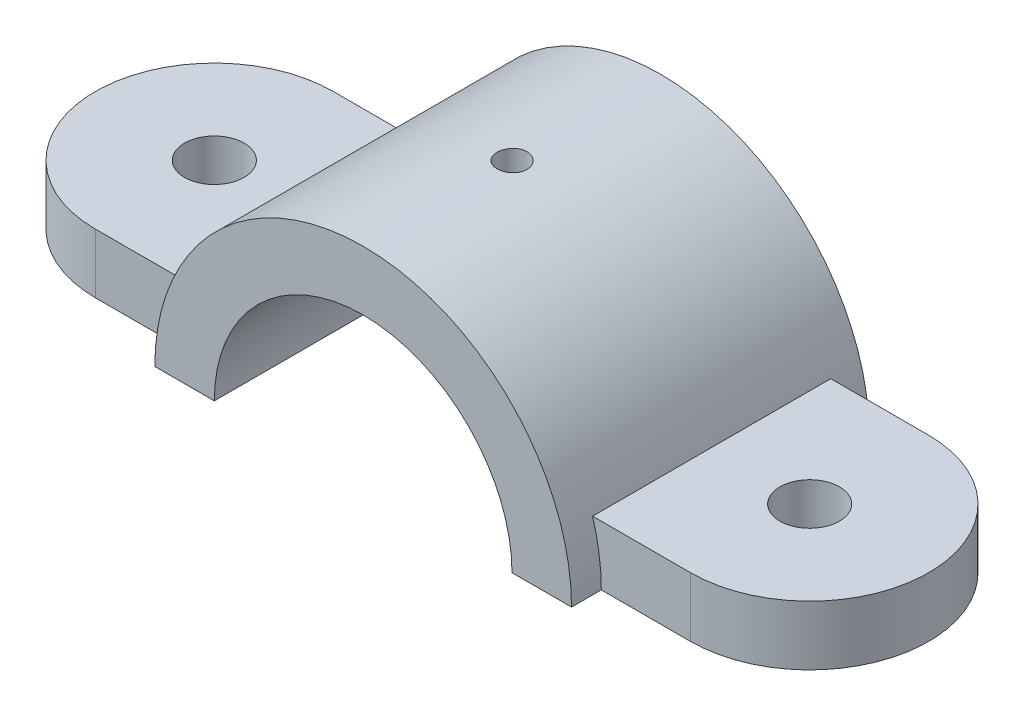
ISO-10303-21;
HEADER;
FILE_DESCRIPTION(('STEP AP214'),'2;1');
FILE_NAME('part.step','',(''),(''),'','','');
FILE_SCHEMA(('AUTOMOTIVE_DESIGN { 1 0 10303 214 1 1 1 1 }'));
ENDSEC;
DATA;
#1=APPLICATION_CONTEXT('core data for automotive mechanical design processes');
#2=APPLICATION_PROTOCOL_DEFINITION('international standard','automotive_design',2000,#1);
#3=PRODUCT_CONTEXT('',#1,'mechanical');
#4=PRODUCT('Part','Part','',(#3));
#5=PRODUCT_RELATED_PRODUCT_CATEGORY('part','',(#4));
#6=PRODUCT_DEFINITION_FORMATION('','',#4);
#7=PRODUCT_DEFINITION_CONTEXT('part definition',#1,'design');
#8=PRODUCT_DEFINITION('design','',#6,#7);
#9=PRODUCT_DEFINITION_SHAPE('','',#8);
#10=(LENGTH_UNIT() NAMED_UNIT(*) SI_UNIT(.MILLI.,.METRE.));
#11=(NAMED_UNIT(*) PLANE_ANGLE_UNIT() SI_UNIT($,.RADIAN.));
#12=(NAMED_UNIT(*) SI_UNIT($,.STERADIAN.) SOLID_ANGLE_UNIT());
#13=UNCERTAINTY_MEASURE_WITH_UNIT(LENGTH_MEASURE(1.E-05),#10,'distance_accuracy_value','');
#14=(GEOMETRIC_REPRESENTATION_CONTEXT(3) GLOBAL_UNCERTAINTY_ASSIGNED_CONTEXT((#13)) GLOBAL_UNIT_ASSIGNED_CONTEXT((#10,
#11,#12)) REPRESENTATION_CONTEXT('',''));
#15=CARTESIAN_POINT('',(0.,0.,0.));
#16=DIRECTION('',(0.,0.,1.));
#17=DIRECTION('',(1.,0.,0.));
#18=AXIS2_PLACEMENT_3D('',#15,#16,#17);
#19=CARTESIAN_POINT('',(63.5,0.,0.));
#20=DIRECTION('',(0.,-1.,0.));
#21=DIRECTION('',(0.,0.,-1.));
#22=AXIS2_PLACEMENT_3D('',#19,#20,#21);
#23=PLANE('',#22);
#24=DIRECTION('',(0.,0.,1.));
#25=VECTOR('',#24,1.);
#26=CARTESIAN_POINT('',(31.75,0.,-31.75));
#27=LINE('',#26,#25);
#28=CARTESIAN_POINT('',(31.75,0.,-31.75));
#29=VERTEX_POINT('',#28);
#30=CARTESIAN_POINT('',(31.75,0.,31.75));
#31=VERTEX_POINT('',#30);
#32=EDGE_CURVE('E139',#29,#31,#27,.T.);
#33=ORIENTED_EDGE('',*,*,#32,.F.);
#34=DIRECTION('',(-1.,0.,0.));
#35=VECTOR('',#34,1.);
#36=CARTESIAN_POINT('',(0.,0.,-31.75));
#37=LINE('',#36,#35);
#38=CARTESIAN_POINT('',(44.45,0.,-31.75));
#39=VERTEX_POINT('',#38);
#40=EDGE_CURVE('E152',#39,#29,#37,.T.);
#41=ORIENTED_EDGE('',*,*,#40,.F.);
#42=DIRECTION('',(0.,0.,-1.));
#43=VECTOR('',#42,1.);
#44=CARTESIAN_POINT('',(44.45,0.,31.75));
#45=LINE('',#44,#43);
#46=CARTESIAN_POINT('',(44.45,0.,-25.4));
#47=VERTEX_POINT('',#46);
#48=EDGE_CURVE('E176',#47,#39,#45,.T.);
#49=ORIENTED_EDGE('',*,*,#48,.F.);
#50=DIRECTION('',(-1.,0.,0.));
#51=VECTOR('',#50,1.);
#52=CARTESIAN_POINT('',(-63.5,0.,-25.4));
#53=LINE('',#52,#51);
#54=CARTESIAN_POINT('',(63.5,0.,-25.4));
#55=VERTEX_POINT('',#54);
#56=EDGE_CURVE('E232',#55,#47,#53,.T.);
#57=ORIENTED_EDGE('',*,*,#56,.F.);
#58=CARTESIAN_POINT('',(63.5,0.,0.));
#59=DIRECTION('',(0.,1.,0.));
#60=DIRECTION('',(0.,0.,-1.));
#61=AXIS2_PLACEMENT_3D('',#58,#59,#60);
#62=CIRCLE('',#61,25.4);
#63=CARTESIAN_POINT('',(63.5,0.,25.4));
#64=VERTEX_POINT('',#63);
#65=EDGE_CURVE('E206',#64,#55,#62,.T.);
#66=ORIENTED_EDGE('',*,*,#65,.F.);
#67=DIRECTION('',(1.,0.,0.));
#68=VECTOR('',#67,1.);
#69=CARTESIAN_POINT('',(63.5,0.,25.4));
#70=LINE('',#69,#68);
#71=CARTESIAN_POINT('',(44.45,0.,25.4));
#72=VERTEX_POINT('',#71);
#73=EDGE_CURVE('E238',#72,#64,#70,.T.);
#74=ORIENTED_EDGE('',*,*,#73,.F.);
#75=CARTESIAN_POINT('',(44.45,0.,31.75));
#76=VERTEX_POINT('',#75);
#77=EDGE_CURVE('E178',#76,#72,#45,.T.);
#78=ORIENTED_EDGE('',*,*,#77,.F.);
#79=DIRECTION('',(-1.,0.,0.));
#80=VECTOR('',#79,1.);
#81=CARTESIAN_POINT('',(0.,0.,31.75));
#82=LINE('',#81,#80);
#83=EDGE_CURVE('E154',#76,#31,#82,.T.);
#84=ORIENTED_EDGE('',*,*,#83,.T.);
#85=EDGE_LOOP('',(#33,#41,#49,#57,#66,#74,#78,#84));
#86=FACE_BOUND('',#85,.T.);
#87=CARTESIAN_POINT('',(63.5,0.,0.));
#88=DIRECTION('',(0.,1.,0.));
#89=DIRECTION('',(0.,0.,-1.));
#90=AXIS2_PLACEMENT_3D('',#87,#88,#89);
#91=CIRCLE('',#90,6.35000000000001);
#92=CARTESIAN_POINT('',(63.5,0.,-6.35000000000001));
#93=VERTEX_POINT('',#92);
#94=EDGE_CURVE('E198',#93,#93,#91,.T.);
#95=ORIENTED_EDGE('',*,*,#94,.T.);
#96=EDGE_LOOP('',(#95));
#97=FACE_BOUND('',#96,.T.);
#98=ADVANCED_FACE('F41',(#86,#97),#23,.T.);
#99=CARTESIAN_POINT('',(63.5,12.7,0.));
#100=DIRECTION('',(0.,-1.,0.));
#101=DIRECTION('',(0.,0.,-1.));
#102=AXIS2_PLACEMENT_3D('',#99,#100,#101);
#103=PLANE('',#102);
#104=CARTESIAN_POINT('',(-63.5,12.7,0.));
#105=DIRECTION('',(0.,1.,0.));
#106=DIRECTION('',(0.,0.,1.));
#107=AXIS2_PLACEMENT_3D('',#104,#105,#106);
#108=CIRCLE('',#107,6.35);
#109=CARTESIAN_POINT('',(-63.5,12.7,6.35));
#110=VERTEX_POINT('',#109);
#111=EDGE_CURVE('E202',#110,#110,#108,.T.);
#112=ORIENTED_EDGE('',*,*,#111,.F.);
#113=EDGE_LOOP('',(#112));
#114=FACE_BOUND('',#113,.T.);
#115=DIRECTION('',(0.,0.,-1.));
#116=VECTOR('',#115,1.);
#117=CARTESIAN_POINT('',(-42.597094971371,12.7,31.75));
#118=LINE('',#117,#116);
#119=CARTESIAN_POINT('',(-42.597094971371,12.7,-25.4));
#120=VERTEX_POINT('',#119);
#121=CARTESIAN_POINT('',(-42.597094971371,12.7,25.4));
#122=VERTEX_POINT('',#121);
#123=EDGE_CURVE('E71',#120,#122,#118,.F.);
#124=ORIENTED_EDGE('',*,*,#123,.F.);
#125=DIRECTION('',(-1.,0.,0.));
#126=VECTOR('',#125,1.);
#127=CARTESIAN_POINT('',(-63.5,12.7,-25.4));
#128=LINE('',#127,#126);
#129=CARTESIAN_POINT('',(-63.5,12.7,-25.4));
#130=VERTEX_POINT('',#129);
#131=EDGE_CURVE('E214',#120,#130,#128,.T.);
#132=ORIENTED_EDGE('',*,*,#131,.T.);
#133=CARTESIAN_POINT('',(-63.5,12.7,0.));
#134=DIRECTION('',(0.,1.,0.));
#135=DIRECTION('',(0.,0.,1.));
#136=AXIS2_PLACEMENT_3D('',#133,#134,#135);
#137=CIRCLE('',#136,25.4);
#138=CARTESIAN_POINT('',(-63.5,12.7,25.4));
#139=VERTEX_POINT('',#138);
#140=EDGE_CURVE('E220',#130,#139,#137,.T.);
#141=ORIENTED_EDGE('',*,*,#140,.T.);
#142=DIRECTION('',(1.,0.,0.));
#143=VECTOR('',#142,1.);
#144=CARTESIAN_POINT('',(63.5,12.7,25.4));
#145=LINE('',#144,#143);
#146=EDGE_CURVE('E224',#139,#122,#145,.T.);
#147=ORIENTED_EDGE('',*,*,#146,.T.);
#148=EDGE_LOOP('',(#124,#132,#141,#147));
#149=FACE_BOUND('',#148,.T.);
#150=ADVANCED_FACE('F281',(#114,#149),#103,.F.);
#151=CARTESIAN_POINT('',(63.5,12.7,0.));
#152=DIRECTION('',(0.,1.,0.));
#153=DIRECTION('',(0.,0.,-1.));
#154=AXIS2_PLACEMENT_3D('',#151,#152,#153);
#155=CIRCLE('',#154,6.35000000000001);
#156=CARTESIAN_POINT('',(63.5,12.7,-6.35000000000001));
#157=VERTEX_POINT('',#156);
#158=EDGE_CURVE('E193',#157,#157,#155,.T.);
#159=ORIENTED_EDGE('',*,*,#158,.F.);
#160=EDGE_LOOP('',(#159));
#161=FACE_BOUND('',#160,.T.);
#162=DIRECTION('',(0.,0.,-1.));
#163=VECTOR('',#162,1.);
#164=CARTESIAN_POINT('',(42.597094971371,12.7,31.75));
#165=LINE('',#164,#163);
#166=CARTESIAN_POINT('',(42.597094971371,12.7,25.4));
#167=VERTEX_POINT('',#166);
#168=CARTESIAN_POINT('',(42.597094971371,12.7,-25.4));
#169=VERTEX_POINT('',#168);
#170=EDGE_CURVE('E188',#167,#169,#165,.T.);
#171=ORIENTED_EDGE('',*,*,#170,.F.);
#172=CARTESIAN_POINT('',(63.5,12.7,25.4));
#173=VERTEX_POINT('',#172);
#174=EDGE_CURVE('E223',#167,#173,#145,.T.);
#175=ORIENTED_EDGE('',*,*,#174,.T.);
#176=CARTESIAN_POINT('',(63.5,12.7,0.));
#177=DIRECTION('',(0.,1.,0.));
#178=DIRECTION('',(0.,0.,-1.));
#179=AXIS2_PLACEMENT_3D('',#176,#177,#178);
#180=CIRCLE('',#179,25.4);
#181=CARTESIAN_POINT('',(63.5,12.7,-25.4));
#182=VERTEX_POINT('',#181);
#183=EDGE_CURVE('E210',#173,#182,#180,.T.);
#184=ORIENTED_EDGE('',*,*,#183,.T.);
#185=EDGE_CURVE('E216',#182,#169,#128,.T.);
#186=ORIENTED_EDGE('',*,*,#185,.T.);
#187=EDGE_LOOP('',(#171,#175,#184,#186));
#188=FACE_BOUND('',#187,.T.);
#189=ADVANCED_FACE('F287',(#161,#188),#103,.F.);
#190=CARTESIAN_POINT('',(-63.5,12.7,-25.4));
#191=DIRECTION('',(0.,0.,1.));
#192=DIRECTION('',(1.,0.,0.));
#193=AXIS2_PLACEMENT_3D('',#190,#191,#192);
#194=PLANE('',#193);
#195=CARTESIAN_POINT('',(0.,0.,-25.4));
#196=DIRECTION('',(0.,0.,1.));
#197=DIRECTION('',(1.,0.,0.));
#198=AXIS2_PLACEMENT_3D('',#195,#196,#197);
#199=CIRCLE('',#198,44.45);
#200=CARTESIAN_POINT('',(-44.45,0.,-25.4));
#201=VERTEX_POINT('',#200);
#202=EDGE_CURVE('E184',#201,#120,#199,.F.);
#203=ORIENTED_EDGE('',*,*,#202,.F.);
#204=CARTESIAN_POINT('',(-63.5,0.,-25.4));
#205=VERTEX_POINT('',#204);
#206=EDGE_CURVE('E231',#201,#205,#53,.T.);
#207=ORIENTED_EDGE('',*,*,#206,.T.);
#208=DIRECTION('',(0.,-1.,0.));
#209=VECTOR('',#208,1.);
#210=CARTESIAN_POINT('',(-63.5,12.7,-25.4));
#211=LINE('',#210,#209);
#212=EDGE_CURVE('E248',#130,#205,#211,.T.);
#213=ORIENTED_EDGE('',*,*,#212,.F.);
#214=ORIENTED_EDGE('',*,*,#131,.F.);
#215=EDGE_LOOP('',(#203,#207,#213,#214));
#216=FACE_BOUND('',#215,.T.);
#217=ADVANCED_FACE('F300',(#216),#194,.F.);
#218=CARTESIAN_POINT('',(63.5,12.7,25.4));
#219=DIRECTION('',(0.,0.,-1.));
#220=DIRECTION('',(-1.,0.,0.));
#221=AXIS2_PLACEMENT_3D('',#218,#219,#220);
#222=PLANE('',#221);
#223=CARTESIAN_POINT('',(0.,0.,25.4));
#224=DIRECTION('',(0.,0.,-1.));
#225=DIRECTION('',(-1.,0.,0.));
#226=AXIS2_PLACEMENT_3D('',#223,#224,#225);
#227=CIRCLE('',#226,44.45);
#228=EDGE_CURVE('E56',#72,#167,#227,.F.);
#229=ORIENTED_EDGE('',*,*,#228,.F.);
#230=ORIENTED_EDGE('',*,*,#73,.T.);
#231=DIRECTION('',(0.,-1.,0.));
#232=VECTOR('',#231,1.);
#233=CARTESIAN_POINT('',(63.5,12.7,25.4));
#234=LINE('',#233,#232);
#235=EDGE_CURVE('E227',#173,#64,#234,.T.);
#236=ORIENTED_EDGE('',*,*,#235,.F.);
#237=ORIENTED_EDGE('',*,*,#174,.F.);
#238=EDGE_LOOP('',(#229,#230,#236,#237));
#239=FACE_BOUND('',#238,.T.);
#240=ADVANCED_FACE('F292',(#239),#222,.F.);
#241=DIRECTION('',(0.,0.,1.));
#242=VECTOR('',#241,1.);
#243=CARTESIAN_POINT('',(-31.75,0.,-31.75));
#244=LINE('',#243,#242);
#245=CARTESIAN_POINT('',(-31.75,0.,31.75));
#246=VERTEX_POINT('',#245);
#247=CARTESIAN_POINT('',(-31.75,0.,-31.75));
#248=VERTEX_POINT('',#247);
#249=EDGE_CURVE('E63',#246,#248,#244,.F.);
#250=ORIENTED_EDGE('',*,*,#249,.F.);
#251=CARTESIAN_POINT('',(-44.45,0.,31.75));
#252=VERTEX_POINT('',#251);
#253=EDGE_CURVE('E166',#246,#252,#82,.T.);
#254=ORIENTED_EDGE('',*,*,#253,.T.);
#255=DIRECTION('',(0.,0.,-1.));
#256=VECTOR('',#255,1.);
#257=CARTESIAN_POINT('',(-44.45,0.,31.75));
#258=LINE('',#257,#256);
#259=CARTESIAN_POINT('',(-44.45,0.,25.4));
#260=VERTEX_POINT('',#259);
#261=EDGE_CURVE('E172',#252,#260,#258,.T.);
#262=ORIENTED_EDGE('',*,*,#261,.T.);
#263=CARTESIAN_POINT('',(-63.5,0.,25.4));
#264=VERTEX_POINT('',#263);
#265=EDGE_CURVE('E215',#264,#260,#70,.T.);
#266=ORIENTED_EDGE('',*,*,#265,.F.);
#267=CARTESIAN_POINT('',(-63.5,0.,0.));
#268=DIRECTION('',(0.,1.,0.));
#269=DIRECTION('',(0.,0.,1.));
#270=AXIS2_PLACEMENT_3D('',#267,#268,#269);
#271=CIRCLE('',#270,25.4);
#272=EDGE_CURVE('E235',#205,#264,#271,.T.);
#273=ORIENTED_EDGE('',*,*,#272,.F.);
#274=ORIENTED_EDGE('',*,*,#206,.F.);
#275=CARTESIAN_POINT('',(-44.45,0.,-31.75));
#276=VERTEX_POINT('',#275);
#277=EDGE_CURVE('E177',#201,#276,#258,.T.);
#278=ORIENTED_EDGE('',*,*,#277,.T.);
#279=EDGE_CURVE('E156',#248,#276,#37,.T.);
#280=ORIENTED_EDGE('',*,*,#279,.F.);
#281=EDGE_LOOP('',(#250,#254,#262,#266,#273,#274,#278,#280));
#282=FACE_BOUND('',#281,.T.);
#283=CARTESIAN_POINT('',(-63.5,0.,0.));
#284=DIRECTION('',(0.,1.,0.));
#285=DIRECTION('',(0.,0.,1.));
#286=AXIS2_PLACEMENT_3D('',#283,#284,#285);
#287=CIRCLE('',#286,6.35);
#288=CARTESIAN_POINT('',(-63.5,0.,6.35));
#289=VERTEX_POINT('',#288);
#290=EDGE_CURVE('E197',#289,#289,#287,.T.);
#291=ORIENTED_EDGE('',*,*,#290,.T.);
#292=EDGE_LOOP('',(#291));
#293=FACE_BOUND('',#292,.T.);
#294=ADVANCED_FACE('F283',(#282,#293),#23,.T.);
#295=CARTESIAN_POINT('',(63.5,12.7,0.));
#296=DIRECTION('',(0.,-1.,0.));
#297=DIRECTION('',(0.,0.,-1.));
#298=AXIS2_PLACEMENT_3D('',#295,#296,#297);
#299=CYLINDRICAL_SURFACE('',#298,25.4);
#300=ORIENTED_EDGE('',*,*,#65,.T.);
#301=DIRECTION('',(0.,-1.,0.));
#302=VECTOR('',#301,1.);
#303=CARTESIAN_POINT('',(63.5,12.7,-25.4));
#304=LINE('',#303,#302);
#305=EDGE_CURVE('E252',#182,#55,#304,.T.);
#306=ORIENTED_EDGE('',*,*,#305,.F.);
#307=ORIENTED_EDGE('',*,*,#183,.F.);
#308=ORIENTED_EDGE('',*,*,#235,.T.);
#309=EDGE_LOOP('',(#300,#306,#307,#308));
#310=FACE_BOUND('',#309,.T.);
#311=ADVANCED_FACE('F43',(#310),#299,.T.);
#312=EDGE_CURVE('E189',#169,#47,#199,.F.);
#313=ORIENTED_EDGE('',*,*,#312,.F.);
#314=ORIENTED_EDGE('',*,*,#185,.F.);
#315=ORIENTED_EDGE('',*,*,#305,.T.);
#316=ORIENTED_EDGE('',*,*,#56,.T.);
#317=EDGE_LOOP('',(#313,#314,#315,#316));
#318=FACE_BOUND('',#317,.T.);
#319=ADVANCED_FACE('F298',(#318),#194,.F.);
#320=CARTESIAN_POINT('',(-63.5,12.7,0.));
#321=DIRECTION('',(0.,-1.,0.));
#322=DIRECTION('',(0.,0.,-1.));
#323=AXIS2_PLACEMENT_3D('',#320,#321,#322);
#324=CYLINDRICAL_SURFACE('',#323,25.4);
#325=ORIENTED_EDGE('',*,*,#272,.T.);
#326=DIRECTION('',(0.,-1.,0.));
#327=VECTOR('',#326,1.);
#328=CARTESIAN_POINT('',(-63.5,12.7,25.4));
#329=LINE('',#328,#327);
#330=EDGE_CURVE('E244',#139,#264,#329,.T.);
#331=ORIENTED_EDGE('',*,*,#330,.F.);
#332=ORIENTED_EDGE('',*,*,#140,.F.);
#333=ORIENTED_EDGE('',*,*,#212,.T.);
#334=EDGE_LOOP('',(#325,#331,#332,#333));
#335=FACE_BOUND('',#334,.T.);
#336=ADVANCED_FACE('F317',(#335),#324,.T.);
#337=EDGE_CURVE('E256',#122,#260,#227,.F.);
#338=ORIENTED_EDGE('',*,*,#337,.F.);
#339=ORIENTED_EDGE('',*,*,#146,.F.);
#340=ORIENTED_EDGE('',*,*,#330,.T.);
#341=ORIENTED_EDGE('',*,*,#265,.T.);
#342=EDGE_LOOP('',(#338,#339,#340,#341));
#343=FACE_BOUND('',#342,.T.);
#344=ADVANCED_FACE('F302',(#343),#222,.F.);
#345=CARTESIAN_POINT('',(-63.5,12.7,0.));
#346=DIRECTION('',(0.,-1.,0.));
#347=DIRECTION('',(0.,0.,-1.));
#348=AXIS2_PLACEMENT_3D('',#345,#346,#347);
#349=CYLINDRICAL_SURFACE('',#348,6.35);
#350=ORIENTED_EDGE('',*,*,#111,.T.);
#351=EDGE_LOOP('',(#350));
#352=FACE_BOUND('',#351,.T.);
#353=ORIENTED_EDGE('',*,*,#290,.F.);
#354=EDGE_LOOP('',(#353));
#355=FACE_BOUND('',#354,.T.);
#356=ADVANCED_FACE('F307',(#352,#355),#349,.F.);
#357=CARTESIAN_POINT('',(63.5,12.7,0.));
#358=DIRECTION('',(0.,-1.,0.));
#359=DIRECTION('',(0.,0.,-1.));
#360=AXIS2_PLACEMENT_3D('',#357,#358,#359);
#361=CYLINDRICAL_SURFACE('',#360,6.35000000000001);
#362=ORIENTED_EDGE('',*,*,#158,.T.);
#363=EDGE_LOOP('',(#362));
#364=FACE_BOUND('',#363,.T.);
#365=ORIENTED_EDGE('',*,*,#94,.F.);
#366=EDGE_LOOP('',(#365));
#367=FACE_BOUND('',#366,.T.);
#368=ADVANCED_FACE('F309',(#364,#367),#361,.F.);
#369=CARTESIAN_POINT('',(0.,0.,31.75));
#370=DIRECTION('',(0.,0.,-1.));
#371=DIRECTION('',(-1.,0.,0.));
#372=AXIS2_PLACEMENT_3D('',#369,#370,#371);
#373=CYLINDRICAL_SURFACE('',#372,44.45);
#374=CARTESIAN_POINT('',(0.,44.45,-3.175));
#375=CARTESIAN_POINT('',(0.17809755969062,44.4499985010204,-3.1749921852915));
#376=CARTESIAN_POINT('',(0.35631846093859,44.4489181935322,-3.15996439283334));
#377=CARTESIAN_POINT('',(0.707835270978344,44.4447124952987,-3.10023344384521));
#378=CARTESIAN_POINT('',(0.881125267556108,44.4415847492453,-3.05549610954538));
#379=CARTESIAN_POINT('',(1.21763791674399,44.4336378558182,-2.9376410589189));
#380=CARTESIAN_POINT('',(1.38086597659549,44.4288196263855,-2.86453874264178));
#381=CARTESIAN_POINT('',(1.69269346722433,44.418033060304,-2.69205484914637));
#382=CARTESIAN_POINT('',(1.84129615082639,44.4120649802704,-2.59267913359277));
#383=CARTESIAN_POINT('',(2.11997998340939,44.3996363409005,-2.37026268279305));
#384=CARTESIAN_POINT('',(2.25002939260178,44.3931749659727,-2.24718222035807));
#385=CARTESIAN_POINT('',(2.48764317829891,44.380494884107,-1.9809330348178));
#386=CARTESIAN_POINT('',(2.5952065966931,44.3742761875187,-1.83776345616511));
#387=CARTESIAN_POINT('',(2.78489768412392,44.3627762652838,-1.53521415441453));
#388=CARTESIAN_POINT('',(2.86699822922461,44.3574960418693,-1.37581738390362));
#389=CARTESIAN_POINT('',(3.00325964148284,44.3484793632232,-1.04545759664348));
#390=CARTESIAN_POINT('',(3.05742088477707,44.3447428872087,-0.874494735639384));
#391=CARTESIAN_POINT('',(3.13617617440064,44.3392430145078,-0.526167808778249));
#392=CARTESIAN_POINT('',(3.16082095687461,44.337476232457,-0.348815268475376));
#393=CARTESIAN_POINT('',(3.18000042163169,44.3361048630515,0.00751738406976762));
#394=CARTESIAN_POINT('',(3.17453553300967,44.3365002448835,0.186497473081446));
#395=CARTESIAN_POINT('',(3.1336928080948,44.3394054749584,0.540658150616265));
#396=CARTESIAN_POINT('',(3.09836996539516,44.3419114358203,0.715845117472151));
#397=CARTESIAN_POINT('',(2.9988993736118,44.3487493276067,1.05779706955871));
#398=CARTESIAN_POINT('',(2.93475140879975,44.353081272197,1.22456199174809));
#399=CARTESIAN_POINT('',(2.7793894028839,44.3630874612053,1.54511214283126));
#400=CARTESIAN_POINT('',(2.68815052276378,44.3687629365025,1.69888529294486));
#401=CARTESIAN_POINT('',(2.4812145802267,44.3808154538232,1.98895478384996));
#402=CARTESIAN_POINT('',(2.36551715598193,44.3871925062249,2.12525086604629));
#403=CARTESIAN_POINT('',(2.11263912589021,44.3999468565423,2.37681715563404));
#404=CARTESIAN_POINT('',(1.97541094694941,44.4063241229682,2.49203954889323));
#405=CARTESIAN_POINT('',(1.68353326582272,44.4183465899756,2.69781856552779));
#406=CARTESIAN_POINT('',(1.52888375563627,44.4239917902211,2.7883751775756));
#407=CARTESIAN_POINT('',(1.20652351982174,44.4339147067992,2.94224843922552));
#408=CARTESIAN_POINT('',(1.03881186894526,44.4381923261505,3.00556315708914));
#409=CARTESIAN_POINT('',(0.695101534536752,44.4448968658532,3.10312281529963));
#410=CARTESIAN_POINT('',(0.519102977405436,44.4473238144234,3.13736819889142));
#411=CARTESIAN_POINT('',(0.164229470601715,44.4500499204039,3.17575756562761));
#412=CARTESIAN_POINT('',(-0.0146382961204218,44.4503537489791,3.17996763115629));
#413=CARTESIAN_POINT('',(-0.370537321569539,44.4488118249658,3.15833969363806));
#414=CARTESIAN_POINT('',(-0.547568592818348,44.4469660870436,3.13250189560341));
#415=CARTESIAN_POINT('',(-0.894582312960256,44.4413357347358,3.05156640913193));
#416=CARTESIAN_POINT('',(-1.06457189733486,44.4375531376683,2.99649916218023));
#417=CARTESIAN_POINT('',(-1.39289741703371,44.4284743676534,2.85869891892336));
#418=CARTESIAN_POINT('',(-1.5512332159126,44.423178176988,2.77596559875991));
#419=CARTESIAN_POINT('',(-1.85205847074147,44.4116551142492,2.58501432949461));
#420=CARTESIAN_POINT('',(-1.99451993838108,44.4054266423692,2.47675238551611));
#421=CARTESIAN_POINT('',(-2.25927051769905,44.3927448859707,2.23788087230796));
#422=CARTESIAN_POINT('',(-2.38155937133055,44.3862915985778,2.10727101724873));
#423=CARTESIAN_POINT('',(-2.60271836127946,44.3738738792979,1.82712545316469));
#424=CARTESIAN_POINT('',(-2.70154552685789,44.3679103572931,1.67755577532192));
#425=CARTESIAN_POINT('',(-2.87268159958821,44.3571593354335,1.36390636365055));
#426=CARTESIAN_POINT('',(-2.94499071056565,44.3523718265397,1.19982674136168));
#427=CARTESIAN_POINT('',(-3.06096414564601,44.3445193603726,0.861970119106408));
#428=CARTESIAN_POINT('',(-3.10465522282774,44.3414527946903,0.688202341357345));
#429=CARTESIAN_POINT('',(-3.16223963020726,44.3373836261545,0.335774660840801));
#430=CARTESIAN_POINT('',(-3.17613336446705,44.3363809953135,0.157114824444557));
#431=CARTESIAN_POINT('',(-3.17372453217148,44.3365534587745,-0.199598343740229));
#432=CARTESIAN_POINT('',(-3.15748950229105,44.3377236824066,-0.377652137869705));
#433=CARTESIAN_POINT('',(-3.09542433897,44.3420996628091,-0.72849816555522));
#434=CARTESIAN_POINT('',(-3.0495941548471,44.3453054230655,-0.901290390100188));
#435=CARTESIAN_POINT('',(-2.92965566407163,44.3533900104309,-1.23671606520818));
#436=CARTESIAN_POINT('',(-2.85554804081302,44.3582687971069,-1.39934976116655));
#437=CARTESIAN_POINT('',(-2.68116669252534,44.3691496822712,-1.70987682459985));
#438=CARTESIAN_POINT('',(-2.58089353963294,44.375151756197,-1.85777051428274));
#439=CARTESIAN_POINT('',(-2.35677531436748,44.3876187401926,-2.13496369125892));
#440=CARTESIAN_POINT('',(-2.23288076532297,44.3940846036465,-2.26422313162537));
#441=CARTESIAN_POINT('',(-1.96511570862737,44.4067421131503,-2.50015779397602));
#442=CARTESIAN_POINT('',(-1.82124034274248,44.412933692025,-2.60682750740843));
#443=CARTESIAN_POINT('',(-1.51738984886767,44.4243532343972,-2.79465826526877));
#444=CARTESIAN_POINT('',(-1.35739121739497,44.429579758747,-2.87578133807944));
#445=CARTESIAN_POINT('',(-1.02612043812863,44.4384621486734,-3.00991083117564));
#446=CARTESIAN_POINT('',(-0.85486165953085,44.4421198394355,-3.06294994136929));
#447=CARTESIAN_POINT('',(-0.568807958256338,44.4465015797572,-3.12572942626643));
#448=CARTESIAN_POINT('',(-0.455858555116116,44.4478076013163,-3.14418173924639));
#449=CARTESIAN_POINT('',(-0.228623044805805,44.4495572918002,-3.16881952317773));
#450=CARTESIAN_POINT('',(-0.114336940124905,44.4500009623306,-3.17500501696856));
#451=CARTESIAN_POINT('',(0.,44.45,-3.175));
#452=B_SPLINE_CURVE_WITH_KNOTS('',3,(#374,#375,#376,#377,#378,#379,#380,#381,#382,#383,#384,
#385,#386,#387,#388,#389,#390,#391,#392,#393,#394,#395,#396,#397,#398,#399,#400,#401,#402,#403,
#404,#405,#406,#407,#408,#409,#410,#411,#412,#413,#414,#415,#416,#417,#418,#419,#420,#421,#422,
#423,#424,#425,#426,#427,#428,#429,#430,#431,#432,#433,#434,#435,#436,#437,#438,#439,#440,#441,
#442,#443,#444,#445,#446,#447,#448,#449,#450,#451),.UNSPECIFIED.,.T.,.F.,(4,2,2,2,2,2,2,2,2,2,2,
2,2,2,2,2,2,2,2,2,2,2,2,2,2,2,2,2,2,2,2,2,2,2,2,2,2,2,4),(0.,0.533875259235039,1.06836575339372,
1.60256646458327,2.13664809461002,2.67163271481404,3.20664012565184,3.74221550288008,
4.27778366966297,4.81242991554011,5.34706854215867,5.88072458989978,6.41438463160984,
6.94853549244861,7.48269425580817,8.01805033204644,8.5534066541421,9.08880093241042,
9.62418704691904,10.1583948641756,10.6925990366306,11.2262479419402,11.7599030943476,
12.2944847333891,12.8290732102362,13.3646333747321,13.9001894226693,14.4352440979471,
14.9702915176574,15.5041410228642,16.0379914423009,16.571828960744,17.105654807249,
17.6406113237351,18.1756981406486,18.7115765781027,19.2468298707823,19.5895733497411,
19.932316190549),.UNSPECIFIED.);
#453=CARTESIAN_POINT('',(0.,44.45,-3.175));
#454=VERTEX_POINT('',#453);
#455=EDGE_CURVE('E11',#454,#454,#452,.T.);
#456=ORIENTED_EDGE('',*,*,#455,.T.);
#457=EDGE_LOOP('',(#456));
#458=FACE_BOUND('',#457,.T.);
#459=ORIENTED_EDGE('',*,*,#170,.T.);
#460=ORIENTED_EDGE('',*,*,#312,.T.);
#461=ORIENTED_EDGE('',*,*,#48,.T.);
#462=CARTESIAN_POINT('',(0.,0.,-31.75));
#463=DIRECTION('',(0.,0.,1.));
#464=DIRECTION('',(1.,0.,0.));
#465=AXIS2_PLACEMENT_3D('',#462,#463,#464);
#466=CIRCLE('',#465,44.45);
#467=EDGE_CURVE('E161',#39,#276,#466,.T.);
#468=ORIENTED_EDGE('',*,*,#467,.T.);
#469=ORIENTED_EDGE('',*,*,#277,.F.);
#470=ORIENTED_EDGE('',*,*,#202,.T.);
#471=ORIENTED_EDGE('',*,*,#123,.T.);
#472=ORIENTED_EDGE('',*,*,#337,.T.);
#473=ORIENTED_EDGE('',*,*,#261,.F.);
#474=CARTESIAN_POINT('',(0.,0.,31.75));
#475=DIRECTION('',(0.,0.,1.));
#476=DIRECTION('',(1.,0.,0.));
#477=AXIS2_PLACEMENT_3D('',#474,#475,#476);
#478=CIRCLE('',#477,44.45);
#479=EDGE_CURVE('E169',#76,#252,#478,.T.);
#480=ORIENTED_EDGE('',*,*,#479,.F.);
#481=ORIENTED_EDGE('',*,*,#77,.T.);
#482=ORIENTED_EDGE('',*,*,#228,.T.);
#483=EDGE_LOOP('',(#459,#460,#461,#468,#469,#470,#471,#472,#473,#480,#481,#482));
#484=FACE_BOUND('',#483,.T.);
#485=ADVANCED_FACE('F263',(#458,#484),#373,.T.);
#486=CARTESIAN_POINT('',(0.,0.,31.75));
#487=DIRECTION('',(0.,0.,1.));
#488=DIRECTION('',(1.,0.,0.));
#489=AXIS2_PLACEMENT_3D('',#486,#487,#488);
#490=PLANE('',#489);
#491=CARTESIAN_POINT('',(0.,0.,31.75));
#492=DIRECTION('',(0.,0.,1.));
#493=DIRECTION('',(1.,0.,0.));
#494=AXIS2_PLACEMENT_3D('',#491,#492,#493);
#495=CIRCLE('',#494,31.75);
#496=EDGE_CURVE('E145',#31,#246,#495,.T.);
#497=ORIENTED_EDGE('',*,*,#496,.F.);
#498=ORIENTED_EDGE('',*,*,#83,.F.);
#499=ORIENTED_EDGE('',*,*,#479,.T.);
#500=ORIENTED_EDGE('',*,*,#253,.F.);
#501=EDGE_LOOP('',(#497,#498,#499,#500));
#502=FACE_BOUND('',#501,.T.);
#503=ADVANCED_FACE('F273',(#502),#490,.T.);
#504=CARTESIAN_POINT('',(0.,0.,-31.75));
#505=DIRECTION('',(0.,0.,1.));
#506=DIRECTION('',(1.,0.,0.));
#507=AXIS2_PLACEMENT_3D('',#504,#505,#506);
#508=PLANE('',#507);
#509=ORIENTED_EDGE('',*,*,#40,.T.);
#510=CARTESIAN_POINT('',(0.,0.,-31.75));
#511=DIRECTION('',(0.,0.,1.));
#512=DIRECTION('',(1.,0.,0.));
#513=AXIS2_PLACEMENT_3D('',#510,#511,#512);
#514=CIRCLE('',#513,31.75);
#515=EDGE_CURVE('E135',#29,#248,#514,.T.);
#516=ORIENTED_EDGE('',*,*,#515,.T.);
#517=ORIENTED_EDGE('',*,*,#279,.T.);
#518=ORIENTED_EDGE('',*,*,#467,.F.);
#519=EDGE_LOOP('',(#509,#516,#517,#518));
#520=FACE_BOUND('',#519,.T.);
#521=ADVANCED_FACE('F159',(#520),#508,.F.);
#522=CARTESIAN_POINT('',(0.,0.,0.));
#523=DIRECTION('',(0.,-1.,0.));
#524=DIRECTION('',(0.,0.,-1.));
#525=AXIS2_PLACEMENT_3D('',#522,#523,#524);
#526=CYLINDRICAL_SURFACE('',#525,3.175);
#527=CARTESIAN_POINT('',(0.,31.75,-3.175));
#528=CARTESIAN_POINT('',(0.177864623288194,31.7499979527844,-3.17499229776629));
#529=CARTESIAN_POINT('',(0.355846840907679,31.7484895126795,-3.16000362125378));
#530=CARTESIAN_POINT('',(0.706876915227456,31.7426170961329,-3.10043712432789));
#531=CARTESIAN_POINT('',(0.879919116361027,31.7382499737803,-3.05582670512193));
#532=CARTESIAN_POINT('',(1.21593506956459,31.7271531623775,-2.93832838610188));
#533=CARTESIAN_POINT('',(1.37891483365234,31.7204249004225,-2.86545756435384));
#534=CARTESIAN_POINT('',(1.69029431104929,31.7053581472692,-2.69354011731702));
#535=CARTESIAN_POINT('',(1.83869691562356,31.6970199763607,-2.59449869719956));
#536=CARTESIAN_POINT('',(2.11727907339021,31.679633882837,-2.37266893492228));
#537=CARTESIAN_POINT('',(2.24739880985078,31.6705837749702,-2.24980563689854));
#538=CARTESIAN_POINT('',(2.48520750554337,31.6528118817738,-1.98397960371488));
#539=CARTESIAN_POINT('',(2.59289542723742,31.6440901116461,-1.84101593936542));
#540=CARTESIAN_POINT('',(2.78299535615848,31.6279400318009,-1.5386731619045));
#541=CARTESIAN_POINT('',(2.86535325281924,31.6205145055712,-1.37925986499882));
#542=CARTESIAN_POINT('',(3.00210977155826,31.6078246921021,-1.04878001475169));
#543=CARTESIAN_POINT('',(3.05650908442734,31.6025603514655,-0.877713749445959));
#544=CARTESIAN_POINT('',(3.13562695708601,31.594808669317,-0.52939378225042));
#545=CARTESIAN_POINT('',(3.16044469828704,31.5923120501396,-0.352162818494239));
#546=CARTESIAN_POINT('',(3.18000153030476,31.5903496671717,0.00396514128160296));
#547=CARTESIAN_POINT('',(3.17474141171479,31.5908838237177,0.182862093387538));
#548=CARTESIAN_POINT('',(3.13437358980225,31.5949141690412,0.536560108276285));
#549=CARTESIAN_POINT('',(3.09937418009545,31.5983996107532,0.711373670368603));
#550=CARTESIAN_POINT('',(3.00068978267811,31.6079230136255,1.05263303316347));
#551=CARTESIAN_POINT('',(2.93700440746199,31.6139610092671,1.21907872079447));
#552=CARTESIAN_POINT('',(2.78263633807378,31.6279215501032,1.53921963967397));
#553=CARTESIAN_POINT('',(2.69190559763593,31.635847444084,1.69289155162858));
#554=CARTESIAN_POINT('',(2.48605683684649,31.6526878925189,1.98286755734522));
#555=CARTESIAN_POINT('',(2.3709381027184,31.6616024759059,2.1191711425921));
#556=CARTESIAN_POINT('',(2.11897630690832,31.6794637336874,2.37117062591516));
#557=CARTESIAN_POINT('',(1.98203972035308,31.6884103763227,2.48677303597155));
#558=CARTESIAN_POINT('',(1.69065410451533,31.705290573243,2.69336403449048));
#559=CARTESIAN_POINT('',(1.53620505559873,31.7132241263921,2.78435259535681));
#560=CARTESIAN_POINT('',(1.21411398557326,31.7271868524303,2.93912931448505));
#561=CARTESIAN_POINT('',(1.04646966978794,31.7332156931689,3.00291272929734));
#562=CARTESIAN_POINT('',(0.702777415022534,31.7426863062647,3.10140006055981));
#563=CARTESIAN_POINT('',(0.526729727515706,31.7461281559868,3.13610484662022));
#564=CARTESIAN_POINT('',(0.172037689616795,31.7500270404689,3.17533117705788));
#565=CARTESIAN_POINT('',(-0.00659225918493622,31.7504968325006,3.17998172820168));
#566=CARTESIAN_POINT('',(-0.362089043777346,31.7484328757783,3.15930640982017));
#567=CARTESIAN_POINT('',(-0.538955903354991,31.7458991676019,3.13398094527398));
#568=CARTESIAN_POINT('',(-0.88553355670009,31.7381211038694,3.05417951703649));
#569=CARTESIAN_POINT('',(-1.05525839548616,31.7328823658977,2.99976395703231));
#570=CARTESIAN_POINT('',(-1.3831707203935,31.7202819638243,2.86338907243166));
#571=CARTESIAN_POINT('',(-1.54135794774885,31.7129202521268,2.78142913029991));
#572=CARTESIAN_POINT('',(-1.84228797204655,31.6968655917409,2.59197208724207));
#573=CARTESIAN_POINT('',(-1.98497716970281,31.6881682594093,2.48439022766053));
#574=CARTESIAN_POINT('',(-2.25031815401521,31.6704323686073,2.24686473492255));
#575=CARTESIAN_POINT('',(-2.37296943759613,31.6613938015768,2.11692054050174));
#576=CARTESIAN_POINT('',(-2.59520089889168,31.643955766469,1.83779612545767));
#577=CARTESIAN_POINT('',(-2.69469640980755,31.6355587169125,1.68854832297717));
#578=CARTESIAN_POINT('',(-2.86720997151165,31.6203911806332,1.37538663153427));
#579=CARTESIAN_POINT('',(-2.94022838437107,31.6136206716682,1.21147294316434));
#580=CARTESIAN_POINT('',(-3.0575732875732,31.6024878373811,0.873922752196103));
#581=CARTESIAN_POINT('',(-3.10195015502765,31.5981212857808,0.700303907710692));
#582=CARTESIAN_POINT('',(-3.16091572263604,31.5922775977313,0.348033346474549));
#583=CARTESIAN_POINT('',(-3.17550527711846,31.5908003784134,0.169381774216235));
#584=CARTESIAN_POINT('',(-3.17447021464623,31.5909043411651,-0.187041435532537));
#585=CARTESIAN_POINT('',(-3.15897859945813,31.5924720602625,-0.364813478152938));
#586=CARTESIAN_POINT('',(-3.09849981315959,31.5984605484931,-0.715216112009314));
#587=CARTESIAN_POINT('',(-3.05351260886985,31.6028813208356,-0.887846697461484));
#588=CARTESIAN_POINT('',(-2.93535635399457,31.6140740673562,-1.22306508322694));
#589=CARTESIAN_POINT('',(-2.8621912032824,31.6208457161565,-1.38565426967437));
#590=CARTESIAN_POINT('',(-2.68976968684256,31.6359778708996,-1.69626563105553));
#591=CARTESIAN_POINT('',(-2.59051346722094,31.6443383679452,-1.8442878875555));
#592=CARTESIAN_POINT('',(-2.36822791620592,31.6617504689079,-2.12224516644839));
#593=CARTESIAN_POINT('',(-2.2450994877266,31.6708048550743,-2.2521007674655));
#594=CARTESIAN_POINT('',(-1.97876064503972,31.6885591376389,-2.48936583882141));
#595=CARTESIAN_POINT('',(-1.83554542754371,31.6972589486045,-2.59676992505901));
#596=CARTESIAN_POINT('',(-1.53270405346209,31.7133465956959,-2.78629571598842));
#597=CARTESIAN_POINT('',(-1.37303747917597,31.7207310728513,-2.86835307375095));
#598=CARTESIAN_POINT('',(-1.04222003614425,31.7333194786842,-3.00438319246578));
#599=CARTESIAN_POINT('',(-0.871082363196308,31.7385258646315,-3.05838761877751));
#600=CARTESIAN_POINT('',(-0.58247997996311,31.744863287316,-3.12331295924424));
#601=CARTESIAN_POINT('',(-0.466860105281314,31.7467805719657,-3.14266911565045));
#602=CARTESIAN_POINT('',(-0.234177144094968,31.7493495996875,-3.16851514524609));
#603=CARTESIAN_POINT('',(-0.117114063544321,31.7500013479788,-3.17500507149691));
#604=CARTESIAN_POINT('',(0.,31.75,-3.175));
#605=B_SPLINE_CURVE_WITH_KNOTS('',3,(#527,#528,#529,#530,#531,#532,#533,#534,#535,#536,#537,
#538,#539,#540,#541,#542,#543,#544,#545,#546,#547,#548,#549,#550,#551,#552,#553,#554,#555,#556,
#557,#558,#559,#560,#561,#562,#563,#564,#565,#566,#567,#568,#569,#570,#571,#572,#573,#574,#575,
#576,#577,#578,#579,#580,#581,#582,#583,#584,#585,#586,#587,#588,#589,#590,#591,#592,#593,#594,
#595,#596,#597,#598,#599,#600,#601,#602,#603,#604),.UNSPECIFIED.,.T.,.F.,(4,2,2,2,2,2,2,2,2,2,2,
2,2,2,2,2,2,2,2,2,2,2,2,2,2,2,2,2,2,2,2,2,2,2,2,2,2,2,4),(0.,0.533166212902403,1.06692015100267,
1.60035203719974,2.13367790682533,2.66870995537785,3.2037667452574,3.73995872124304,
4.27613744854949,4.81051336743498,5.3448752403709,5.87729956875525,6.40973108963186,
6.94311417358939,7.47651287051322,8.01226281072955,8.54801335160774,9.0838572670212,
9.61968515719519,10.1532114882963,10.6867306114828,11.2191461955942,11.7515737170706,
12.2857876187712,12.8200149304748,13.356165934573,13.8923096065931,14.4275076763278,
14.9626903958568,15.4955122300831,16.0283346636767,16.5610833802689,17.093829113612,
17.628835628328,18.1639702962234,18.7004525350832,19.2363278847506,19.587389934627,
19.9384505366916),.UNSPECIFIED.);
#606=CARTESIAN_POINT('',(0.,31.75,-3.175));
#607=VERTEX_POINT('',#606);
#608=EDGE_CURVE('E45',#607,#607,#605,.T.);
#609=ORIENTED_EDGE('',*,*,#608,.T.);
#610=EDGE_LOOP('',(#609));
#611=FACE_BOUND('',#610,.T.);
#612=ORIENTED_EDGE('',*,*,#455,.F.);
#613=EDGE_LOOP('',(#612));
#614=FACE_BOUND('',#613,.T.);
#615=ADVANCED_FACE('F267',(#611,#614),#526,.F.);
#616=CARTESIAN_POINT('',(0.,0.,-31.75));
#617=DIRECTION('',(0.,0.,1.));
#618=DIRECTION('',(1.,0.,0.));
#619=AXIS2_PLACEMENT_3D('',#616,#617,#618);
#620=CYLINDRICAL_SURFACE('',#619,31.75);
#621=ORIENTED_EDGE('',*,*,#32,.T.);
#622=ORIENTED_EDGE('',*,*,#496,.T.);
#623=ORIENTED_EDGE('',*,*,#249,.T.);
#624=ORIENTED_EDGE('',*,*,#515,.F.);
#625=EDGE_LOOP('',(#621,#622,#623,#624));
#626=FACE_BOUND('',#625,.T.);
#627=ORIENTED_EDGE('',*,*,#608,.F.);
#628=EDGE_LOOP('',(#627));
#629=FACE_BOUND('',#628,.T.);
#630=ADVANCED_FACE('F137',(#626,#629),#620,.F.);
#631=CLOSED_SHELL('',(#98,#150,#189,#217,#240,#294,#311,#319,#336,#344,#356,#368,#485,#503,#521,
#615,#630));
#632=MANIFOLD_SOLID_BREP('B2',#631);
#633=ADVANCED_BREP_SHAPE_REPRESENTATION('',(#18,#632),#14);
#634=SHAPE_DEFINITION_REPRESENTATION(#9,#633);
ENDSEC;
END-ISO-10303-21;
